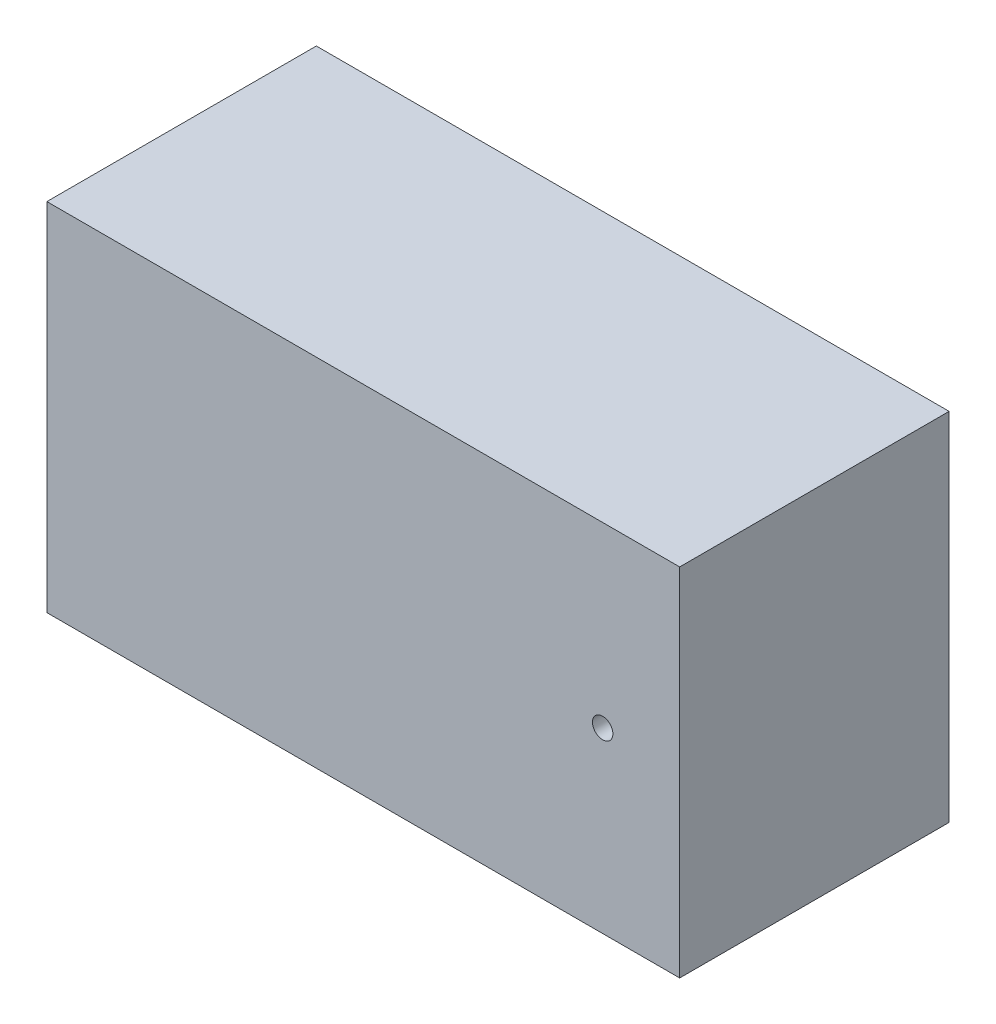
ISO-10303-21;
HEADER;
FILE_DESCRIPTION(('STEP AP214'),'2;1');
FILE_NAME('part.step','',(''),(''),'','','');
FILE_SCHEMA(('AUTOMOTIVE_DESIGN { 1 0 10303 214 1 1 1 1 }'));
ENDSEC;
DATA;
#1=APPLICATION_CONTEXT('core data for automotive mechanical design processes');
#2=APPLICATION_PROTOCOL_DEFINITION('international standard','automotive_design',2000,#1);
#3=PRODUCT_CONTEXT('',#1,'mechanical');
#4=PRODUCT('Part','Part','',(#3));
#5=PRODUCT_RELATED_PRODUCT_CATEGORY('part','',(#4));
#6=PRODUCT_DEFINITION_FORMATION('','',#4);
#7=PRODUCT_DEFINITION_CONTEXT('part definition',#1,'design');
#8=PRODUCT_DEFINITION('design','',#6,#7);
#9=PRODUCT_DEFINITION_SHAPE('','',#8);
#10=(LENGTH_UNIT() NAMED_UNIT(*) SI_UNIT(.MILLI.,.METRE.));
#11=(NAMED_UNIT(*) PLANE_ANGLE_UNIT() SI_UNIT($,.RADIAN.));
#12=(NAMED_UNIT(*) SI_UNIT($,.STERADIAN.) SOLID_ANGLE_UNIT());
#13=UNCERTAINTY_MEASURE_WITH_UNIT(LENGTH_MEASURE(1.E-05),#10,'distance_accuracy_value','');
#14=(GEOMETRIC_REPRESENTATION_CONTEXT(3) GLOBAL_UNCERTAINTY_ASSIGNED_CONTEXT((#13)) GLOBAL_UNIT_ASSIGNED_CONTEXT((#10,
#11,#12)) REPRESENTATION_CONTEXT('',''));
#15=CARTESIAN_POINT('',(0.,0.,0.));
#16=DIRECTION('',(0.,0.,1.));
#17=DIRECTION('',(1.,0.,0.));
#18=AXIS2_PLACEMENT_3D('',#15,#16,#17);
#19=CARTESIAN_POINT('',(-77.5,43.6,66.));
#20=DIRECTION('',(1.,0.,0.));
#21=DIRECTION('',(0.,0.,-1.));
#22=AXIS2_PLACEMENT_3D('',#19,#20,#21);
#23=PLANE('',#22);
#24=DIRECTION('',(0.,0.,1.));
#25=VECTOR('',#24,1.);
#26=CARTESIAN_POINT('',(-77.5,-20.,13.));
#27=LINE('',#26,#25);
#28=CARTESIAN_POINT('',(-77.5,-20.,13.));
#29=VERTEX_POINT('',#28);
#30=CARTESIAN_POINT('',(-77.5,-20.,53.));
#31=VERTEX_POINT('',#30);
#32=EDGE_CURVE('E135',#29,#31,#27,.T.);
#33=ORIENTED_EDGE('',*,*,#32,.F.);
#34=DIRECTION('',(0.,-1.,0.));
#35=VECTOR('',#34,1.);
#36=CARTESIAN_POINT('',(-77.5,20.,13.));
#37=LINE('',#36,#35);
#38=CARTESIAN_POINT('',(-77.5,20.,13.));
#39=VERTEX_POINT('',#38);
#40=EDGE_CURVE('E47',#39,#29,#37,.T.);
#41=ORIENTED_EDGE('',*,*,#40,.F.);
#42=DIRECTION('',(0.,0.,-1.));
#43=VECTOR('',#42,1.);
#44=CARTESIAN_POINT('',(-77.5,20.,13.));
#45=LINE('',#44,#43);
#46=CARTESIAN_POINT('',(-77.5,20.,53.));
#47=VERTEX_POINT('',#46);
#48=EDGE_CURVE('E126',#47,#39,#45,.T.);
#49=ORIENTED_EDGE('',*,*,#48,.F.);
#50=DIRECTION('',(0.,1.,0.));
#51=VECTOR('',#50,1.);
#52=CARTESIAN_POINT('',(-77.5,20.,53.));
#53=LINE('',#52,#51);
#54=EDGE_CURVE('E129',#31,#47,#53,.T.);
#55=ORIENTED_EDGE('',*,*,#54,.F.);
#56=EDGE_LOOP('',(#33,#41,#49,#55));
#57=FACE_BOUND('',#56,.T.);
#58=DIRECTION('',(0.,-1.,0.));
#59=VECTOR('',#58,1.);
#60=CARTESIAN_POINT('',(-77.5,43.6,0.));
#61=LINE('',#60,#59);
#62=CARTESIAN_POINT('',(-77.5,43.6,0.));
#63=VERTEX_POINT('',#62);
#64=CARTESIAN_POINT('',(-77.5,-43.6,0.));
#65=VERTEX_POINT('',#64);
#66=EDGE_CURVE('E148',#63,#65,#61,.T.);
#67=ORIENTED_EDGE('',*,*,#66,.T.);
#68=DIRECTION('',(0.,0.,-1.));
#69=VECTOR('',#68,1.);
#70=CARTESIAN_POINT('',(-77.5,-43.6,66.));
#71=LINE('',#70,#69);
#72=CARTESIAN_POINT('',(-77.5,-43.6,66.));
#73=VERTEX_POINT('',#72);
#74=EDGE_CURVE('E11',#73,#65,#71,.T.);
#75=ORIENTED_EDGE('',*,*,#74,.F.);
#76=DIRECTION('',(0.,-1.,0.));
#77=VECTOR('',#76,1.);
#78=CARTESIAN_POINT('',(-77.5,43.6,66.));
#79=LINE('',#78,#77);
#80=CARTESIAN_POINT('',(-77.5,43.6,66.));
#81=VERTEX_POINT('',#80);
#82=EDGE_CURVE('E151',#81,#73,#79,.T.);
#83=ORIENTED_EDGE('',*,*,#82,.F.);
#84=DIRECTION('',(0.,0.,-1.));
#85=VECTOR('',#84,1.);
#86=CARTESIAN_POINT('',(-77.5,43.6,66.));
#87=LINE('',#86,#85);
#88=EDGE_CURVE('E157',#81,#63,#87,.T.);
#89=ORIENTED_EDGE('',*,*,#88,.T.);
#90=EDGE_LOOP('',(#67,#75,#83,#89));
#91=FACE_BOUND('',#90,.T.);
#92=ADVANCED_FACE('F33',(#57,#91),#23,.F.);
#93=CARTESIAN_POINT('',(-77.5,-43.6,66.));
#94=DIRECTION('',(0.,1.,0.));
#95=DIRECTION('',(0.,0.,1.));
#96=AXIS2_PLACEMENT_3D('',#93,#94,#95);
#97=PLANE('',#96);
#98=DIRECTION('',(1.,0.,0.));
#99=VECTOR('',#98,1.);
#100=CARTESIAN_POINT('',(-77.5,-43.6,0.));
#101=LINE('',#100,#99);
#102=CARTESIAN_POINT('',(77.5,-43.6,0.));
#103=VERTEX_POINT('',#102);
#104=EDGE_CURVE('E160',#65,#103,#101,.T.);
#105=ORIENTED_EDGE('',*,*,#104,.T.);
#106=DIRECTION('',(0.,0.,-1.));
#107=VECTOR('',#106,1.);
#108=CARTESIAN_POINT('',(77.5,-43.6,66.));
#109=LINE('',#108,#107);
#110=CARTESIAN_POINT('',(77.5,-43.6,66.));
#111=VERTEX_POINT('',#110);
#112=EDGE_CURVE('E40',#111,#103,#109,.T.);
#113=ORIENTED_EDGE('',*,*,#112,.F.);
#114=DIRECTION('',(1.,0.,0.));
#115=VECTOR('',#114,1.);
#116=CARTESIAN_POINT('',(-77.5,-43.6,66.));
#117=LINE('',#116,#115);
#118=EDGE_CURVE('E84',#73,#111,#117,.T.);
#119=ORIENTED_EDGE('',*,*,#118,.F.);
#120=ORIENTED_EDGE('',*,*,#74,.T.);
#121=EDGE_LOOP('',(#105,#113,#119,#120));
#122=FACE_BOUND('',#121,.T.);
#123=ADVANCED_FACE('F189',(#122),#97,.F.);
#124=CARTESIAN_POINT('',(77.5,43.6,66.));
#125=DIRECTION('',(-1.,0.,0.));
#126=DIRECTION('',(0.,0.,1.));
#127=AXIS2_PLACEMENT_3D('',#124,#125,#126);
#128=PLANE('',#127);
#129=DIRECTION('',(0.,1.,0.));
#130=VECTOR('',#129,1.);
#131=CARTESIAN_POINT('',(77.5,43.6,0.));
#132=LINE('',#131,#130);
#133=CARTESIAN_POINT('',(77.5,43.6,0.));
#134=VERTEX_POINT('',#133);
#135=EDGE_CURVE('E162',#103,#134,#132,.T.);
#136=ORIENTED_EDGE('',*,*,#135,.T.);
#137=DIRECTION('',(0.,0.,-1.));
#138=VECTOR('',#137,1.);
#139=CARTESIAN_POINT('',(77.5,43.6,66.));
#140=LINE('',#139,#138);
#141=CARTESIAN_POINT('',(77.5,43.6,66.));
#142=VERTEX_POINT('',#141);
#143=EDGE_CURVE('E166',#142,#134,#140,.T.);
#144=ORIENTED_EDGE('',*,*,#143,.F.);
#145=DIRECTION('',(0.,1.,0.));
#146=VECTOR('',#145,1.);
#147=CARTESIAN_POINT('',(77.5,43.6,66.));
#148=LINE('',#147,#146);
#149=EDGE_CURVE('E154',#111,#142,#148,.T.);
#150=ORIENTED_EDGE('',*,*,#149,.F.);
#151=ORIENTED_EDGE('',*,*,#112,.T.);
#152=EDGE_LOOP('',(#136,#144,#150,#151));
#153=FACE_BOUND('',#152,.T.);
#154=ADVANCED_FACE('F171',(#153),#128,.F.);
#155=CARTESIAN_POINT('',(-77.5,43.6,66.));
#156=DIRECTION('',(0.,-1.,0.));
#157=DIRECTION('',(0.,0.,-1.));
#158=AXIS2_PLACEMENT_3D('',#155,#156,#157);
#159=PLANE('',#158);
#160=DIRECTION('',(-1.,0.,0.));
#161=VECTOR('',#160,1.);
#162=CARTESIAN_POINT('',(-77.5,43.6,0.));
#163=LINE('',#162,#161);
#164=EDGE_CURVE('E77',#134,#63,#163,.T.);
#165=ORIENTED_EDGE('',*,*,#164,.T.);
#166=ORIENTED_EDGE('',*,*,#88,.F.);
#167=DIRECTION('',(-1.,0.,0.));
#168=VECTOR('',#167,1.);
#169=CARTESIAN_POINT('',(-77.5,43.6,66.));
#170=LINE('',#169,#168);
#171=EDGE_CURVE('E56',#142,#81,#170,.T.);
#172=ORIENTED_EDGE('',*,*,#171,.F.);
#173=ORIENTED_EDGE('',*,*,#143,.T.);
#174=EDGE_LOOP('',(#165,#166,#172,#173));
#175=FACE_BOUND('',#174,.T.);
#176=ADVANCED_FACE('F179',(#175),#159,.F.);
#177=CARTESIAN_POINT('',(0.,0.,66.));
#178=DIRECTION('',(0.,0.,1.));
#179=DIRECTION('',(1.,0.,0.));
#180=AXIS2_PLACEMENT_3D('',#177,#178,#179);
#181=PLANE('',#180);
#182=CARTESIAN_POINT('',(58.64,0.,66.));
#183=DIRECTION('',(0.,0.,1.));
#184=DIRECTION('',(1.,0.,0.));
#185=AXIS2_PLACEMENT_3D('',#182,#183,#184);
#186=CIRCLE('',#185,2.5);
#187=CARTESIAN_POINT('',(61.14,0.,66.));
#188=VERTEX_POINT('',#187);
#189=EDGE_CURVE('E141',#188,#188,#186,.T.);
#190=ORIENTED_EDGE('',*,*,#189,.F.);
#191=EDGE_LOOP('',(#190));
#192=FACE_BOUND('',#191,.T.);
#193=ORIENTED_EDGE('',*,*,#82,.T.);
#194=ORIENTED_EDGE('',*,*,#118,.T.);
#195=ORIENTED_EDGE('',*,*,#149,.T.);
#196=ORIENTED_EDGE('',*,*,#171,.T.);
#197=EDGE_LOOP('',(#193,#194,#195,#196));
#198=FACE_BOUND('',#197,.T.);
#199=ADVANCED_FACE('F181',(#192,#198),#181,.T.);
#200=CARTESIAN_POINT('',(0.,0.,0.));
#201=DIRECTION('',(0.,0.,1.));
#202=DIRECTION('',(1.,0.,0.));
#203=AXIS2_PLACEMENT_3D('',#200,#201,#202);
#204=PLANE('',#203);
#205=CARTESIAN_POINT('',(58.64,0.,0.));
#206=DIRECTION('',(0.,0.,1.));
#207=DIRECTION('',(1.,0.,0.));
#208=AXIS2_PLACEMENT_3D('',#205,#206,#207);
#209=CIRCLE('',#208,2.5);
#210=CARTESIAN_POINT('',(61.14,0.,0.));
#211=VERTEX_POINT('',#210);
#212=EDGE_CURVE('E145',#211,#211,#209,.T.);
#213=ORIENTED_EDGE('',*,*,#212,.T.);
#214=EDGE_LOOP('',(#213));
#215=FACE_BOUND('',#214,.T.);
#216=ORIENTED_EDGE('',*,*,#66,.F.);
#217=ORIENTED_EDGE('',*,*,#164,.F.);
#218=ORIENTED_EDGE('',*,*,#135,.F.);
#219=ORIENTED_EDGE('',*,*,#104,.F.);
#220=EDGE_LOOP('',(#216,#217,#218,#219));
#221=FACE_BOUND('',#220,.T.);
#222=ADVANCED_FACE('F175',(#215,#221),#204,.F.);
#223=CARTESIAN_POINT('',(58.64,0.,0.));
#224=DIRECTION('',(0.,0.,1.));
#225=DIRECTION('',(1.,0.,0.));
#226=AXIS2_PLACEMENT_3D('',#223,#224,#225);
#227=CYLINDRICAL_SURFACE('',#226,2.5);
#228=ORIENTED_EDGE('',*,*,#212,.F.);
#229=EDGE_LOOP('',(#228));
#230=FACE_BOUND('',#229,.T.);
#231=ORIENTED_EDGE('',*,*,#189,.T.);
#232=EDGE_LOOP('',(#231));
#233=FACE_BOUND('',#232,.T.);
#234=ADVANCED_FACE('F210',(#230,#233),#227,.F.);
#235=CARTESIAN_POINT('',(34.5,20.,13.));
#236=DIRECTION('',(0.,0.,-1.));
#237=DIRECTION('',(0.,1.,0.));
#238=AXIS2_PLACEMENT_3D('',#235,#236,#237);
#239=PLANE('',#238);
#240=ORIENTED_EDGE('',*,*,#40,.T.);
#241=DIRECTION('',(-1.,0.,0.));
#242=VECTOR('',#241,1.);
#243=CARTESIAN_POINT('',(34.5,-20.,13.));
#244=LINE('',#243,#242);
#245=CARTESIAN_POINT('',(34.5,-20.,13.));
#246=VERTEX_POINT('',#245);
#247=EDGE_CURVE('E104',#246,#29,#244,.T.);
#248=ORIENTED_EDGE('',*,*,#247,.F.);
#249=DIRECTION('',(0.,-1.,0.));
#250=VECTOR('',#249,1.);
#251=CARTESIAN_POINT('',(34.5,20.,13.));
#252=LINE('',#251,#250);
#253=CARTESIAN_POINT('',(34.5,20.,13.));
#254=VERTEX_POINT('',#253);
#255=EDGE_CURVE('E108',#254,#246,#252,.T.);
#256=ORIENTED_EDGE('',*,*,#255,.F.);
#257=DIRECTION('',(-1.,0.,0.));
#258=VECTOR('',#257,1.);
#259=CARTESIAN_POINT('',(34.5,20.,13.));
#260=LINE('',#259,#258);
#261=EDGE_CURVE('E139',#254,#39,#260,.T.);
#262=ORIENTED_EDGE('',*,*,#261,.T.);
#263=EDGE_LOOP('',(#240,#248,#256,#262));
#264=FACE_BOUND('',#263,.T.);
#265=ADVANCED_FACE('F106',(#264),#239,.F.);
#266=CARTESIAN_POINT('',(34.5,20.,13.));
#267=DIRECTION('',(0.,1.,0.));
#268=DIRECTION('',(0.,0.,1.));
#269=AXIS2_PLACEMENT_3D('',#266,#267,#268);
#270=PLANE('',#269);
#271=ORIENTED_EDGE('',*,*,#48,.T.);
#272=ORIENTED_EDGE('',*,*,#261,.F.);
#273=DIRECTION('',(0.,0.,-1.));
#274=VECTOR('',#273,1.);
#275=CARTESIAN_POINT('',(34.5,20.,13.));
#276=LINE('',#275,#274);
#277=CARTESIAN_POINT('',(34.5,20.,53.));
#278=VERTEX_POINT('',#277);
#279=EDGE_CURVE('E114',#278,#254,#276,.T.);
#280=ORIENTED_EDGE('',*,*,#279,.F.);
#281=DIRECTION('',(-1.,0.,0.));
#282=VECTOR('',#281,1.);
#283=CARTESIAN_POINT('',(34.5,20.,53.));
#284=LINE('',#283,#282);
#285=EDGE_CURVE('E142',#278,#47,#284,.T.);
#286=ORIENTED_EDGE('',*,*,#285,.T.);
#287=EDGE_LOOP('',(#271,#272,#280,#286));
#288=FACE_BOUND('',#287,.T.);
#289=ADVANCED_FACE('F202',(#288),#270,.F.);
#290=CARTESIAN_POINT('',(34.5,20.,53.));
#291=DIRECTION('',(0.,0.,1.));
#292=DIRECTION('',(0.,-1.,0.));
#293=AXIS2_PLACEMENT_3D('',#290,#291,#292);
#294=PLANE('',#293);
#295=ORIENTED_EDGE('',*,*,#54,.T.);
#296=ORIENTED_EDGE('',*,*,#285,.F.);
#297=DIRECTION('',(0.,1.,0.));
#298=VECTOR('',#297,1.);
#299=CARTESIAN_POINT('',(34.5,20.,53.));
#300=LINE('',#299,#298);
#301=CARTESIAN_POINT('',(34.5,-20.,53.));
#302=VERTEX_POINT('',#301);
#303=EDGE_CURVE('E122',#302,#278,#300,.T.);
#304=ORIENTED_EDGE('',*,*,#303,.F.);
#305=DIRECTION('',(-1.,0.,0.));
#306=VECTOR('',#305,1.);
#307=CARTESIAN_POINT('',(34.5,-20.,53.));
#308=LINE('',#307,#306);
#309=EDGE_CURVE('E113',#302,#31,#308,.T.);
#310=ORIENTED_EDGE('',*,*,#309,.T.);
#311=EDGE_LOOP('',(#295,#296,#304,#310));
#312=FACE_BOUND('',#311,.T.);
#313=ADVANCED_FACE('F200',(#312),#294,.F.);
#314=CARTESIAN_POINT('',(34.5,-20.,13.));
#315=DIRECTION('',(0.,-1.,0.));
#316=DIRECTION('',(0.,0.,-1.));
#317=AXIS2_PLACEMENT_3D('',#314,#315,#316);
#318=PLANE('',#317);
#319=ORIENTED_EDGE('',*,*,#32,.T.);
#320=ORIENTED_EDGE('',*,*,#309,.F.);
#321=DIRECTION('',(0.,0.,1.));
#322=VECTOR('',#321,1.);
#323=CARTESIAN_POINT('',(34.5,-20.,13.));
#324=LINE('',#323,#322);
#325=EDGE_CURVE('E117',#246,#302,#324,.T.);
#326=ORIENTED_EDGE('',*,*,#325,.F.);
#327=ORIENTED_EDGE('',*,*,#247,.T.);
#328=EDGE_LOOP('',(#319,#320,#326,#327));
#329=FACE_BOUND('',#328,.T.);
#330=ADVANCED_FACE('F118',(#329),#318,.F.);
#331=CARTESIAN_POINT('',(34.5,0.,0.));
#332=DIRECTION('',(-1.,0.,0.));
#333=DIRECTION('',(0.,0.,1.));
#334=AXIS2_PLACEMENT_3D('',#331,#332,#333);
#335=PLANE('',#334);
#336=ORIENTED_EDGE('',*,*,#255,.T.);
#337=ORIENTED_EDGE('',*,*,#325,.T.);
#338=ORIENTED_EDGE('',*,*,#303,.T.);
#339=ORIENTED_EDGE('',*,*,#279,.T.);
#340=EDGE_LOOP('',(#336,#337,#338,#339));
#341=FACE_BOUND('',#340,.T.);
#342=ADVANCED_FACE('F124',(#341),#335,.T.);
#343=CLOSED_SHELL('',(#92,#123,#154,#176,#199,#222,#234,#265,#289,#313,#330,#342));
#344=MANIFOLD_SOLID_BREP('B2',#343);
#345=ADVANCED_BREP_SHAPE_REPRESENTATION('',(#18,#344),#14);
#346=SHAPE_DEFINITION_REPRESENTATION(#9,#345);
ENDSEC;
END-ISO-10303-21;
